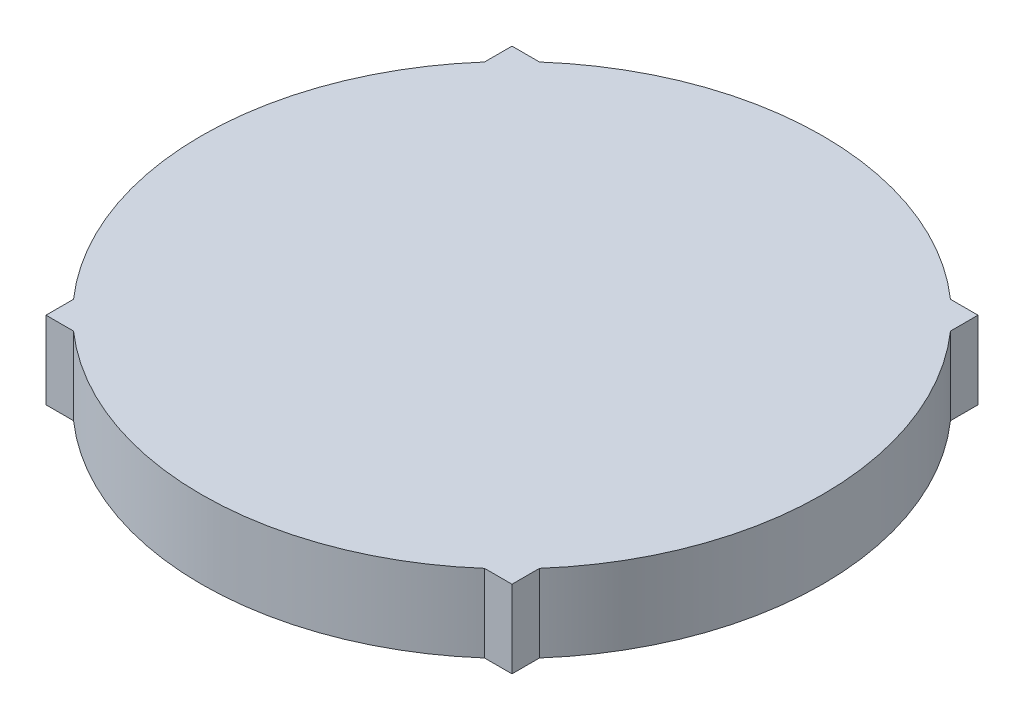
ISO-10303-21;
HEADER;
FILE_DESCRIPTION(('STEP AP214'),'2;1');
FILE_NAME('part.step','',(''),(''),'','','');
FILE_SCHEMA(('AUTOMOTIVE_DESIGN { 1 0 10303 214 1 1 1 1 }'));
ENDSEC;
DATA;
#1=APPLICATION_CONTEXT('core data for automotive mechanical design processes');
#2=APPLICATION_PROTOCOL_DEFINITION('international standard','automotive_design',2000,#1);
#3=PRODUCT_CONTEXT('',#1,'mechanical');
#4=PRODUCT('Part','Part','',(#3));
#5=PRODUCT_RELATED_PRODUCT_CATEGORY('part','',(#4));
#6=PRODUCT_DEFINITION_FORMATION('','',#4);
#7=PRODUCT_DEFINITION_CONTEXT('part definition',#1,'design');
#8=PRODUCT_DEFINITION('design','',#6,#7);
#9=PRODUCT_DEFINITION_SHAPE('','',#8);
#10=(LENGTH_UNIT() NAMED_UNIT(*) SI_UNIT(.MILLI.,.METRE.));
#11=(NAMED_UNIT(*) PLANE_ANGLE_UNIT() SI_UNIT($,.RADIAN.));
#12=(NAMED_UNIT(*) SI_UNIT($,.STERADIAN.) SOLID_ANGLE_UNIT());
#13=UNCERTAINTY_MEASURE_WITH_UNIT(LENGTH_MEASURE(1.E-05),#10,'distance_accuracy_value','');
#14=(GEOMETRIC_REPRESENTATION_CONTEXT(3) GLOBAL_UNCERTAINTY_ASSIGNED_CONTEXT((#13)) GLOBAL_UNIT_ASSIGNED_CONTEXT((#10,
#11,#12)) REPRESENTATION_CONTEXT('',''));
#15=CARTESIAN_POINT('',(0.,0.,0.));
#16=DIRECTION('',(0.,0.,1.));
#17=DIRECTION('',(1.,0.,0.));
#18=AXIS2_PLACEMENT_3D('',#15,#16,#17);
#19=CARTESIAN_POINT('',(25.3432053585644,-63.6421572875255,-26.4749999999998));
#20=DIRECTION('',(0.,0.,-1.));
#21=DIRECTION('',(-1.,0.,0.));
#22=AXIS2_PLACEMENT_3D('',#19,#20,#21);
#23=PLANE('',#22);
#24=DIRECTION('',(1.,0.,0.));
#25=VECTOR('',#24,1.);
#26=CARTESIAN_POINT('',(25.3432053585644,-66.8171572875255,-26.4749999999998));
#27=LINE('',#26,#25);
#28=CARTESIAN_POINT('',(25.3432053585644,-66.8171572875255,-26.4749999999998));
#29=VERTEX_POINT('',#28);
#30=CARTESIAN_POINT('',(26.467944945934,-66.8171572875255,-26.4749999999998));
#31=VERTEX_POINT('',#30);
#32=EDGE_CURVE('E154',#29,#31,#27,.T.);
#33=ORIENTED_EDGE('',*,*,#32,.F.);
#34=DIRECTION('',(0.,-1.,0.));
#35=VECTOR('',#34,1.);
#36=CARTESIAN_POINT('',(25.3432053585644,-63.6421572875255,-26.4749999999998));
#37=LINE('',#36,#35);
#38=CARTESIAN_POINT('',(25.3432053585644,-63.6421572875255,-26.4749999999998));
#39=VERTEX_POINT('',#38);
#40=EDGE_CURVE('E11',#39,#29,#37,.T.);
#41=ORIENTED_EDGE('',*,*,#40,.F.);
#42=DIRECTION('',(1.,0.,0.));
#43=VECTOR('',#42,1.);
#44=CARTESIAN_POINT('',(25.3432053585644,-63.6421572875255,-26.4749999999998));
#45=LINE('',#44,#43);
#46=CARTESIAN_POINT('',(26.467944945934,-63.6421572875255,-26.4749999999998));
#47=VERTEX_POINT('',#46);
#48=EDGE_CURVE('E187',#39,#47,#45,.T.);
#49=ORIENTED_EDGE('',*,*,#48,.T.);
#50=DIRECTION('',(0.,-1.,0.));
#51=VECTOR('',#50,1.);
#52=CARTESIAN_POINT('',(26.467944945934,-63.6421572875255,-26.4749999999998));
#53=LINE('',#52,#51);
#54=EDGE_CURVE('E36',#47,#31,#53,.T.);
#55=ORIENTED_EDGE('',*,*,#54,.T.);
#56=EDGE_LOOP('',(#33,#41,#49,#55));
#57=FACE_BOUND('',#56,.T.);
#58=ADVANCED_FACE('F33',(#57),#23,.T.);
#59=CARTESIAN_POINT('',(16.9429449459342,-63.6421572875255,-16.9499999999999));
#60=DIRECTION('',(0.,-1.,0.));
#61=DIRECTION('',(0.,0.,-1.));
#62=AXIS2_PLACEMENT_3D('',#59,#60,#61);
#63=CYLINDRICAL_SURFACE('',#62,12.7);
#64=CARTESIAN_POINT('',(16.9429449459342,-66.8171572875255,-16.9499999999999));
#65=DIRECTION('',(0.,-1.,0.));
#66=DIRECTION('',(0.,0.,-1.));
#67=AXIS2_PLACEMENT_3D('',#64,#65,#66);
#68=CIRCLE('',#67,12.7);
#69=CARTESIAN_POINT('',(8.54268453330396,-66.8171572875255,-26.4749999999998));
#70=VERTEX_POINT('',#69);
#71=EDGE_CURVE('E185',#70,#29,#68,.T.);
#72=ORIENTED_EDGE('',*,*,#71,.F.);
#73=DIRECTION('',(0.,-1.,0.));
#74=VECTOR('',#73,1.);
#75=CARTESIAN_POINT('',(8.54268453330396,-63.6421572875255,-26.4749999999998));
#76=LINE('',#75,#74);
#77=CARTESIAN_POINT('',(8.54268453330396,-63.6421572875255,-26.4749999999998));
#78=VERTEX_POINT('',#77);
#79=EDGE_CURVE('E42',#78,#70,#76,.T.);
#80=ORIENTED_EDGE('',*,*,#79,.F.);
#81=CARTESIAN_POINT('',(16.9429449459342,-63.6421572875255,-16.9499999999999));
#82=DIRECTION('',(0.,-1.,0.));
#83=DIRECTION('',(0.,0.,-1.));
#84=AXIS2_PLACEMENT_3D('',#81,#82,#83);
#85=CIRCLE('',#84,12.7);
#86=EDGE_CURVE('E144',#78,#39,#85,.T.);
#87=ORIENTED_EDGE('',*,*,#86,.T.);
#88=ORIENTED_EDGE('',*,*,#40,.T.);
#89=EDGE_LOOP('',(#72,#80,#87,#88));
#90=FACE_BOUND('',#89,.T.);
#91=ADVANCED_FACE('F207',(#90),#63,.T.);
#92=CARTESIAN_POINT('',(7.41794494593401,-63.6421572875255,-26.4749999999998));
#93=DIRECTION('',(0.,0.,-1.));
#94=DIRECTION('',(-1.,0.,0.));
#95=AXIS2_PLACEMENT_3D('',#92,#93,#94);
#96=PLANE('',#95);
#97=DIRECTION('',(1.,0.,0.));
#98=VECTOR('',#97,1.);
#99=CARTESIAN_POINT('',(7.41794494593401,-66.8171572875255,-26.4749999999998));
#100=LINE('',#99,#98);
#101=CARTESIAN_POINT('',(7.41794494593401,-66.8171572875255,-26.4749999999998));
#102=VERTEX_POINT('',#101);
#103=EDGE_CURVE('E131',#102,#70,#100,.T.);
#104=ORIENTED_EDGE('',*,*,#103,.F.);
#105=DIRECTION('',(0.,-1.,0.));
#106=VECTOR('',#105,1.);
#107=CARTESIAN_POINT('',(7.41794494593401,-63.6421572875255,-26.4749999999998));
#108=LINE('',#107,#106);
#109=CARTESIAN_POINT('',(7.41794494593401,-63.6421572875255,-26.4749999999998));
#110=VERTEX_POINT('',#109);
#111=EDGE_CURVE('E126',#110,#102,#108,.T.);
#112=ORIENTED_EDGE('',*,*,#111,.F.);
#113=DIRECTION('',(1.,0.,0.));
#114=VECTOR('',#113,1.);
#115=CARTESIAN_POINT('',(7.41794494593401,-63.6421572875255,-26.4749999999998));
#116=LINE('',#115,#114);
#117=EDGE_CURVE('E129',#110,#78,#116,.T.);
#118=ORIENTED_EDGE('',*,*,#117,.T.);
#119=ORIENTED_EDGE('',*,*,#79,.T.);
#120=EDGE_LOOP('',(#104,#112,#118,#119));
#121=FACE_BOUND('',#120,.T.);
#122=ADVANCED_FACE('F128',(#121),#96,.T.);
#123=CARTESIAN_POINT('',(7.41794494593401,-63.6421572875255,-25.3502604126298));
#124=DIRECTION('',(-1.,0.,0.));
#125=DIRECTION('',(0.,0.,1.));
#126=AXIS2_PLACEMENT_3D('',#123,#124,#125);
#127=PLANE('',#126);
#128=DIRECTION('',(0.,0.,-1.));
#129=VECTOR('',#128,1.);
#130=CARTESIAN_POINT('',(7.41794494593401,-66.8171572875255,-25.3502604126298));
#131=LINE('',#130,#129);
#132=CARTESIAN_POINT('',(7.41794494593401,-66.8171572875255,-25.3502604126298));
#133=VERTEX_POINT('',#132);
#134=EDGE_CURVE('E182',#133,#102,#131,.T.);
#135=ORIENTED_EDGE('',*,*,#134,.F.);
#136=DIRECTION('',(0.,-1.,0.));
#137=VECTOR('',#136,1.);
#138=CARTESIAN_POINT('',(7.41794494593401,-63.6421572875255,-25.3502604126298));
#139=LINE('',#138,#137);
#140=CARTESIAN_POINT('',(7.41794494593401,-63.6421572875255,-25.3502604126298));
#141=VERTEX_POINT('',#140);
#142=EDGE_CURVE('E136',#141,#133,#139,.T.);
#143=ORIENTED_EDGE('',*,*,#142,.F.);
#144=DIRECTION('',(0.,0.,-1.));
#145=VECTOR('',#144,1.);
#146=CARTESIAN_POINT('',(7.41794494593401,-63.6421572875255,-25.3502604126298));
#147=LINE('',#146,#145);
#148=EDGE_CURVE('E142',#141,#110,#147,.T.);
#149=ORIENTED_EDGE('',*,*,#148,.T.);
#150=ORIENTED_EDGE('',*,*,#111,.T.);
#151=EDGE_LOOP('',(#135,#143,#149,#150));
#152=FACE_BOUND('',#151,.T.);
#153=ADVANCED_FACE('F146',(#152),#127,.T.);
#154=CARTESIAN_POINT('',(16.9429449459342,-63.6421572875255,-16.9499999999999));
#155=DIRECTION('',(0.,-1.,0.));
#156=DIRECTION('',(0.,0.,-1.));
#157=AXIS2_PLACEMENT_3D('',#154,#155,#156);
#158=CYLINDRICAL_SURFACE('',#157,12.7);
#159=CARTESIAN_POINT('',(16.9429449459342,-66.8171572875255,-16.9499999999999));
#160=DIRECTION('',(0.,-1.,0.));
#161=DIRECTION('',(0.,0.,-1.));
#162=AXIS2_PLACEMENT_3D('',#159,#160,#161);
#163=CIRCLE('',#162,12.7);
#164=CARTESIAN_POINT('',(7.41794494593399,-66.8171572875255,-8.54973958737004));
#165=VERTEX_POINT('',#164);
#166=EDGE_CURVE('E179',#165,#133,#163,.T.);
#167=ORIENTED_EDGE('',*,*,#166,.F.);
#168=DIRECTION('',(0.,-1.,0.));
#169=VECTOR('',#168,1.);
#170=CARTESIAN_POINT('',(7.41794494593399,-63.6421572875255,-8.54973958737004));
#171=LINE('',#170,#169);
#172=CARTESIAN_POINT('',(7.41794494593399,-63.6421572875255,-8.54973958737004));
#173=VERTEX_POINT('',#172);
#174=EDGE_CURVE('E191',#173,#165,#171,.T.);
#175=ORIENTED_EDGE('',*,*,#174,.F.);
#176=CARTESIAN_POINT('',(16.9429449459342,-63.6421572875255,-16.9499999999999));
#177=DIRECTION('',(0.,-1.,0.));
#178=DIRECTION('',(0.,0.,-1.));
#179=AXIS2_PLACEMENT_3D('',#176,#177,#178);
#180=CIRCLE('',#179,12.7);
#181=EDGE_CURVE('E147',#173,#141,#180,.T.);
#182=ORIENTED_EDGE('',*,*,#181,.T.);
#183=ORIENTED_EDGE('',*,*,#142,.T.);
#184=EDGE_LOOP('',(#167,#175,#182,#183));
#185=FACE_BOUND('',#184,.T.);
#186=ADVANCED_FACE('F220',(#185),#158,.T.);
#187=CARTESIAN_POINT('',(7.41794494593399,-63.6421572875255,-7.42499999999978));
#188=DIRECTION('',(-1.,0.,0.));
#189=DIRECTION('',(0.,0.,1.));
#190=AXIS2_PLACEMENT_3D('',#187,#188,#189);
#191=PLANE('',#190);
#192=DIRECTION('',(0.,0.,-1.));
#193=VECTOR('',#192,1.);
#194=CARTESIAN_POINT('',(7.41794494593399,-66.8171572875255,-7.42499999999978));
#195=LINE('',#194,#193);
#196=CARTESIAN_POINT('',(7.41794494593399,-66.8171572875255,-7.42499999999978));
#197=VERTEX_POINT('',#196);
#198=EDGE_CURVE('E176',#197,#165,#195,.T.);
#199=ORIENTED_EDGE('',*,*,#198,.F.);
#200=DIRECTION('',(0.,-1.,0.));
#201=VECTOR('',#200,1.);
#202=CARTESIAN_POINT('',(7.41794494593399,-63.6421572875255,-7.42499999999978));
#203=LINE('',#202,#201);
#204=CARTESIAN_POINT('',(7.41794494593399,-63.6421572875255,-7.42499999999978));
#205=VERTEX_POINT('',#204);
#206=EDGE_CURVE('E193',#205,#197,#203,.T.);
#207=ORIENTED_EDGE('',*,*,#206,.F.);
#208=DIRECTION('',(0.,0.,-1.));
#209=VECTOR('',#208,1.);
#210=CARTESIAN_POINT('',(7.41794494593399,-63.6421572875255,-7.42499999999978));
#211=LINE('',#210,#209);
#212=EDGE_CURVE('E149',#205,#173,#211,.T.);
#213=ORIENTED_EDGE('',*,*,#212,.T.);
#214=ORIENTED_EDGE('',*,*,#174,.T.);
#215=EDGE_LOOP('',(#199,#207,#213,#214));
#216=FACE_BOUND('',#215,.T.);
#217=ADVANCED_FACE('F223',(#216),#191,.T.);
#218=CARTESIAN_POINT('',(8.54268453330425,-63.6421572875255,-7.42499999999978));
#219=DIRECTION('',(0.,0.,1.));
#220=DIRECTION('',(1.,0.,0.));
#221=AXIS2_PLACEMENT_3D('',#218,#219,#220);
#222=PLANE('',#221);
#223=DIRECTION('',(-1.,0.,0.));
#224=VECTOR('',#223,1.);
#225=CARTESIAN_POINT('',(8.54268453330425,-66.8171572875255,-7.42499999999978));
#226=LINE('',#225,#224);
#227=CARTESIAN_POINT('',(8.54268453330425,-66.8171572875255,-7.42499999999978));
#228=VERTEX_POINT('',#227);
#229=EDGE_CURVE('E173',#228,#197,#226,.T.);
#230=ORIENTED_EDGE('',*,*,#229,.F.);
#231=DIRECTION('',(0.,-1.,0.));
#232=VECTOR('',#231,1.);
#233=CARTESIAN_POINT('',(8.54268453330425,-63.6421572875255,-7.42499999999978));
#234=LINE('',#233,#232);
#235=CARTESIAN_POINT('',(8.54268453330425,-63.6421572875255,-7.42499999999978));
#236=VERTEX_POINT('',#235);
#237=EDGE_CURVE('E195',#236,#228,#234,.T.);
#238=ORIENTED_EDGE('',*,*,#237,.F.);
#239=DIRECTION('',(-1.,0.,0.));
#240=VECTOR('',#239,1.);
#241=CARTESIAN_POINT('',(8.54268453330425,-63.6421572875255,-7.42499999999978));
#242=LINE('',#241,#240);
#243=EDGE_CURVE('E287',#236,#205,#242,.T.);
#244=ORIENTED_EDGE('',*,*,#243,.T.);
#245=ORIENTED_EDGE('',*,*,#206,.T.);
#246=EDGE_LOOP('',(#230,#238,#244,#245));
#247=FACE_BOUND('',#246,.T.);
#248=ADVANCED_FACE('F227',(#247),#222,.T.);
#249=CARTESIAN_POINT('',(16.9429449459342,-63.6421572875255,-16.9499999999999));
#250=DIRECTION('',(0.,-1.,0.));
#251=DIRECTION('',(0.,0.,-1.));
#252=AXIS2_PLACEMENT_3D('',#249,#250,#251);
#253=CYLINDRICAL_SURFACE('',#252,12.7);
#254=CARTESIAN_POINT('',(16.9429449459342,-66.8171572875255,-16.9499999999999));
#255=DIRECTION('',(0.,-1.,0.));
#256=DIRECTION('',(0.,0.,-1.));
#257=AXIS2_PLACEMENT_3D('',#254,#255,#256);
#258=CIRCLE('',#257,12.7);
#259=CARTESIAN_POINT('',(25.3432053585641,-66.8171572875255,-7.42499999999975));
#260=VERTEX_POINT('',#259);
#261=EDGE_CURVE('E170',#260,#228,#258,.T.);
#262=ORIENTED_EDGE('',*,*,#261,.F.);
#263=DIRECTION('',(0.,-1.,0.));
#264=VECTOR('',#263,1.);
#265=CARTESIAN_POINT('',(25.3432053585641,-63.6421572875255,-7.42499999999975));
#266=LINE('',#265,#264);
#267=CARTESIAN_POINT('',(25.3432053585641,-63.6421572875255,-7.42499999999975));
#268=VERTEX_POINT('',#267);
#269=EDGE_CURVE('E197',#268,#260,#266,.T.);
#270=ORIENTED_EDGE('',*,*,#269,.F.);
#271=CARTESIAN_POINT('',(16.9429449459342,-63.6421572875255,-16.9499999999999));
#272=DIRECTION('',(0.,-1.,0.));
#273=DIRECTION('',(0.,0.,-1.));
#274=AXIS2_PLACEMENT_3D('',#271,#272,#273);
#275=CIRCLE('',#274,12.7);
#276=EDGE_CURVE('E284',#268,#236,#275,.T.);
#277=ORIENTED_EDGE('',*,*,#276,.T.);
#278=ORIENTED_EDGE('',*,*,#237,.T.);
#279=EDGE_LOOP('',(#262,#270,#277,#278));
#280=FACE_BOUND('',#279,.T.);
#281=ADVANCED_FACE('F231',(#280),#253,.T.);
#282=CARTESIAN_POINT('',(26.467944945934,-63.6421572875255,-7.42499999999975));
#283=DIRECTION('',(0.,0.,1.));
#284=DIRECTION('',(1.,0.,0.));
#285=AXIS2_PLACEMENT_3D('',#282,#283,#284);
#286=PLANE('',#285);
#287=DIRECTION('',(-1.,0.,0.));
#288=VECTOR('',#287,1.);
#289=CARTESIAN_POINT('',(26.467944945934,-66.8171572875255,-7.42499999999975));
#290=LINE('',#289,#288);
#291=CARTESIAN_POINT('',(26.467944945934,-66.8171572875255,-7.42499999999975));
#292=VERTEX_POINT('',#291);
#293=EDGE_CURVE('E167',#292,#260,#290,.T.);
#294=ORIENTED_EDGE('',*,*,#293,.F.);
#295=DIRECTION('',(0.,-1.,0.));
#296=VECTOR('',#295,1.);
#297=CARTESIAN_POINT('',(26.467944945934,-63.6421572875255,-7.42499999999975));
#298=LINE('',#297,#296);
#299=CARTESIAN_POINT('',(26.467944945934,-63.6421572875255,-7.42499999999975));
#300=VERTEX_POINT('',#299);
#301=EDGE_CURVE('E199',#300,#292,#298,.T.);
#302=ORIENTED_EDGE('',*,*,#301,.F.);
#303=DIRECTION('',(-1.,0.,0.));
#304=VECTOR('',#303,1.);
#305=CARTESIAN_POINT('',(26.467944945934,-63.6421572875255,-7.42499999999975));
#306=LINE('',#305,#304);
#307=EDGE_CURVE('E281',#300,#268,#306,.T.);
#308=ORIENTED_EDGE('',*,*,#307,.T.);
#309=ORIENTED_EDGE('',*,*,#269,.T.);
#310=EDGE_LOOP('',(#294,#302,#308,#309));
#311=FACE_BOUND('',#310,.T.);
#312=ADVANCED_FACE('F235',(#311),#286,.T.);
#313=CARTESIAN_POINT('',(26.467944945934,-63.6421572875255,-8.54973958736962));
#314=DIRECTION('',(1.,0.,0.));
#315=DIRECTION('',(0.,0.,-1.));
#316=AXIS2_PLACEMENT_3D('',#313,#314,#315);
#317=PLANE('',#316);
#318=DIRECTION('',(0.,0.,1.));
#319=VECTOR('',#318,1.);
#320=CARTESIAN_POINT('',(26.467944945934,-66.8171572875255,-8.54973958736962));
#321=LINE('',#320,#319);
#322=CARTESIAN_POINT('',(26.467944945934,-66.8171572875255,-8.54973958736962));
#323=VERTEX_POINT('',#322);
#324=EDGE_CURVE('E164',#323,#292,#321,.T.);
#325=ORIENTED_EDGE('',*,*,#324,.F.);
#326=DIRECTION('',(0.,-1.,0.));
#327=VECTOR('',#326,1.);
#328=CARTESIAN_POINT('',(26.467944945934,-63.6421572875255,-8.54973958736962));
#329=LINE('',#328,#327);
#330=CARTESIAN_POINT('',(26.467944945934,-63.6421572875255,-8.54973958736962));
#331=VERTEX_POINT('',#330);
#332=EDGE_CURVE('E201',#331,#323,#329,.T.);
#333=ORIENTED_EDGE('',*,*,#332,.F.);
#334=DIRECTION('',(0.,0.,1.));
#335=VECTOR('',#334,1.);
#336=CARTESIAN_POINT('',(26.467944945934,-63.6421572875255,-8.54973958736962));
#337=LINE('',#336,#335);
#338=EDGE_CURVE('E278',#331,#300,#337,.T.);
#339=ORIENTED_EDGE('',*,*,#338,.T.);
#340=ORIENTED_EDGE('',*,*,#301,.T.);
#341=EDGE_LOOP('',(#325,#333,#339,#340));
#342=FACE_BOUND('',#341,.T.);
#343=ADVANCED_FACE('F239',(#342),#317,.T.);
#344=CARTESIAN_POINT('',(16.9429449459342,-63.6421572875255,-16.9499999999999));
#345=DIRECTION('',(0.,-1.,0.));
#346=DIRECTION('',(0.,0.,-1.));
#347=AXIS2_PLACEMENT_3D('',#344,#345,#346);
#348=CYLINDRICAL_SURFACE('',#347,12.7);
#349=CARTESIAN_POINT('',(16.9429449459342,-66.8171572875255,-16.9499999999999));
#350=DIRECTION('',(0.,-1.,0.));
#351=DIRECTION('',(0.,0.,-1.));
#352=AXIS2_PLACEMENT_3D('',#349,#350,#351);
#353=CIRCLE('',#352,12.7);
#354=CARTESIAN_POINT('',(26.467944945934,-66.8171572875255,-25.3502604126302));
#355=VERTEX_POINT('',#354);
#356=EDGE_CURVE('E161',#355,#323,#353,.T.);
#357=ORIENTED_EDGE('',*,*,#356,.F.);
#358=DIRECTION('',(0.,-1.,0.));
#359=VECTOR('',#358,1.);
#360=CARTESIAN_POINT('',(26.467944945934,-63.6421572875255,-25.3502604126302));
#361=LINE('',#360,#359);
#362=CARTESIAN_POINT('',(26.467944945934,-63.6421572875255,-25.3502604126302));
#363=VERTEX_POINT('',#362);
#364=EDGE_CURVE('E202',#363,#355,#361,.T.);
#365=ORIENTED_EDGE('',*,*,#364,.F.);
#366=CARTESIAN_POINT('',(16.9429449459342,-63.6421572875255,-16.9499999999999));
#367=DIRECTION('',(0.,-1.,0.));
#368=DIRECTION('',(0.,0.,-1.));
#369=AXIS2_PLACEMENT_3D('',#366,#367,#368);
#370=CIRCLE('',#369,12.7);
#371=EDGE_CURVE('E275',#363,#331,#370,.T.);
#372=ORIENTED_EDGE('',*,*,#371,.T.);
#373=ORIENTED_EDGE('',*,*,#332,.T.);
#374=EDGE_LOOP('',(#357,#365,#372,#373));
#375=FACE_BOUND('',#374,.T.);
#376=ADVANCED_FACE('F243',(#375),#348,.T.);
#377=CARTESIAN_POINT('',(26.467944945934,-63.6421572875255,-26.4749999999998));
#378=DIRECTION('',(1.,0.,0.));
#379=DIRECTION('',(0.,0.,-1.));
#380=AXIS2_PLACEMENT_3D('',#377,#378,#379);
#381=PLANE('',#380);
#382=DIRECTION('',(0.,0.,1.));
#383=VECTOR('',#382,1.);
#384=CARTESIAN_POINT('',(26.467944945934,-66.8171572875255,-26.4749999999998));
#385=LINE('',#384,#383);
#386=EDGE_CURVE('E157',#31,#355,#385,.T.);
#387=ORIENTED_EDGE('',*,*,#386,.F.);
#388=ORIENTED_EDGE('',*,*,#54,.F.);
#389=DIRECTION('',(0.,0.,1.));
#390=VECTOR('',#389,1.);
#391=CARTESIAN_POINT('',(26.467944945934,-63.6421572875255,-26.4749999999998));
#392=LINE('',#391,#390);
#393=EDGE_CURVE('E273',#47,#363,#392,.T.);
#394=ORIENTED_EDGE('',*,*,#393,.T.);
#395=ORIENTED_EDGE('',*,*,#364,.T.);
#396=EDGE_LOOP('',(#387,#388,#394,#395));
#397=FACE_BOUND('',#396,.T.);
#398=ADVANCED_FACE('F204',(#397),#381,.T.);
#399=CARTESIAN_POINT('',(16.9429449459342,-63.6421572875255,-16.9499999999999));
#400=DIRECTION('',(0.,-1.,0.));
#401=DIRECTION('',(0.,0.,-1.));
#402=AXIS2_PLACEMENT_3D('',#399,#400,#401);
#403=PLANE('',#402);
#404=ORIENTED_EDGE('',*,*,#48,.F.);
#405=ORIENTED_EDGE('',*,*,#86,.F.);
#406=ORIENTED_EDGE('',*,*,#117,.F.);
#407=ORIENTED_EDGE('',*,*,#148,.F.);
#408=ORIENTED_EDGE('',*,*,#181,.F.);
#409=ORIENTED_EDGE('',*,*,#212,.F.);
#410=ORIENTED_EDGE('',*,*,#243,.F.);
#411=ORIENTED_EDGE('',*,*,#276,.F.);
#412=ORIENTED_EDGE('',*,*,#307,.F.);
#413=ORIENTED_EDGE('',*,*,#338,.F.);
#414=ORIENTED_EDGE('',*,*,#371,.F.);
#415=ORIENTED_EDGE('',*,*,#393,.F.);
#416=EDGE_LOOP('',(#404,#405,#406,#407,#408,#409,#410,#411,#412,#413,#414,#415));
#417=FACE_BOUND('',#416,.T.);
#418=ADVANCED_FACE('F140',(#417),#403,.F.);
#419=CARTESIAN_POINT('',(16.9429449459342,-66.8171572875255,-16.9499999999999));
#420=DIRECTION('',(0.,-1.,0.));
#421=DIRECTION('',(0.,0.,-1.));
#422=AXIS2_PLACEMENT_3D('',#419,#420,#421);
#423=PLANE('',#422);
#424=CARTESIAN_POINT('',(16.9429449459342,-66.8171572875255,-16.9499999999999));
#425=DIRECTION('',(0.,-1.,0.));
#426=DIRECTION('',(0.,0.,-1.));
#427=AXIS2_PLACEMENT_3D('',#424,#425,#426);
#428=CIRCLE('',#427,6.2992);
#429=CARTESIAN_POINT('',(16.9429449459342,-66.8171572875255,-23.2491999999999));
#430=VERTEX_POINT('',#429);
#431=EDGE_CURVE('E267',#430,#430,#428,.T.);
#432=ORIENTED_EDGE('',*,*,#431,.F.);
#433=EDGE_LOOP('',(#432));
#434=FACE_BOUND('',#433,.T.);
#435=ORIENTED_EDGE('',*,*,#32,.T.);
#436=ORIENTED_EDGE('',*,*,#386,.T.);
#437=ORIENTED_EDGE('',*,*,#356,.T.);
#438=ORIENTED_EDGE('',*,*,#324,.T.);
#439=ORIENTED_EDGE('',*,*,#293,.T.);
#440=ORIENTED_EDGE('',*,*,#261,.T.);
#441=ORIENTED_EDGE('',*,*,#229,.T.);
#442=ORIENTED_EDGE('',*,*,#198,.T.);
#443=ORIENTED_EDGE('',*,*,#166,.T.);
#444=ORIENTED_EDGE('',*,*,#134,.T.);
#445=ORIENTED_EDGE('',*,*,#103,.T.);
#446=ORIENTED_EDGE('',*,*,#71,.T.);
#447=EDGE_LOOP('',(#435,#436,#437,#438,#439,#440,#441,#442,#443,#444,#445,#446));
#448=FACE_BOUND('',#447,.T.);
#449=ADVANCED_FACE('F206',(#434,#448),#423,.T.);
#450=CARTESIAN_POINT('',(16.9429449459342,-64.2771572875255,-16.9499999999999));
#451=DIRECTION('',(0.,-1.,0.));
#452=DIRECTION('',(0.,0.,-1.));
#453=AXIS2_PLACEMENT_3D('',#450,#451,#452);
#454=CYLINDRICAL_SURFACE('',#453,6.2992);
#455=CARTESIAN_POINT('',(16.9429449459342,-64.2771572875255,-16.9499999999999));
#456=DIRECTION('',(0.,-1.,0.));
#457=DIRECTION('',(0.,0.,-1.));
#458=AXIS2_PLACEMENT_3D('',#455,#456,#457);
#459=CIRCLE('',#458,6.2992);
#460=CARTESIAN_POINT('',(16.9429449459342,-64.2771572875255,-23.2491999999999));
#461=VERTEX_POINT('',#460);
#462=EDGE_CURVE('E158',#461,#461,#459,.T.);
#463=ORIENTED_EDGE('',*,*,#462,.F.);
#464=EDGE_LOOP('',(#463));
#465=FACE_BOUND('',#464,.T.);
#466=ORIENTED_EDGE('',*,*,#431,.T.);
#467=EDGE_LOOP('',(#466));
#468=FACE_BOUND('',#467,.T.);
#469=ADVANCED_FACE('F254',(#465,#468),#454,.F.);
#470=CARTESIAN_POINT('',(16.9429449459342,-64.2771572875255,-16.9499999999999));
#471=DIRECTION('',(0.,-1.,0.));
#472=DIRECTION('',(0.,0.,-1.));
#473=AXIS2_PLACEMENT_3D('',#470,#471,#472);
#474=PLANE('',#473);
#475=ORIENTED_EDGE('',*,*,#462,.T.);
#476=EDGE_LOOP('',(#475));
#477=FACE_BOUND('',#476,.T.);
#478=ADVANCED_FACE('F259',(#477),#474,.T.);
#479=CLOSED_SHELL('',(#58,#91,#122,#153,#186,#217,#248,#281,#312,#343,#376,#398,#418,#449,#469,#478));
#480=MANIFOLD_SOLID_BREP('B2',#479);
#481=ADVANCED_BREP_SHAPE_REPRESENTATION('',(#18,#480),#14);
#482=SHAPE_DEFINITION_REPRESENTATION(#9,#481);
ENDSEC;
END-ISO-10303-21;
